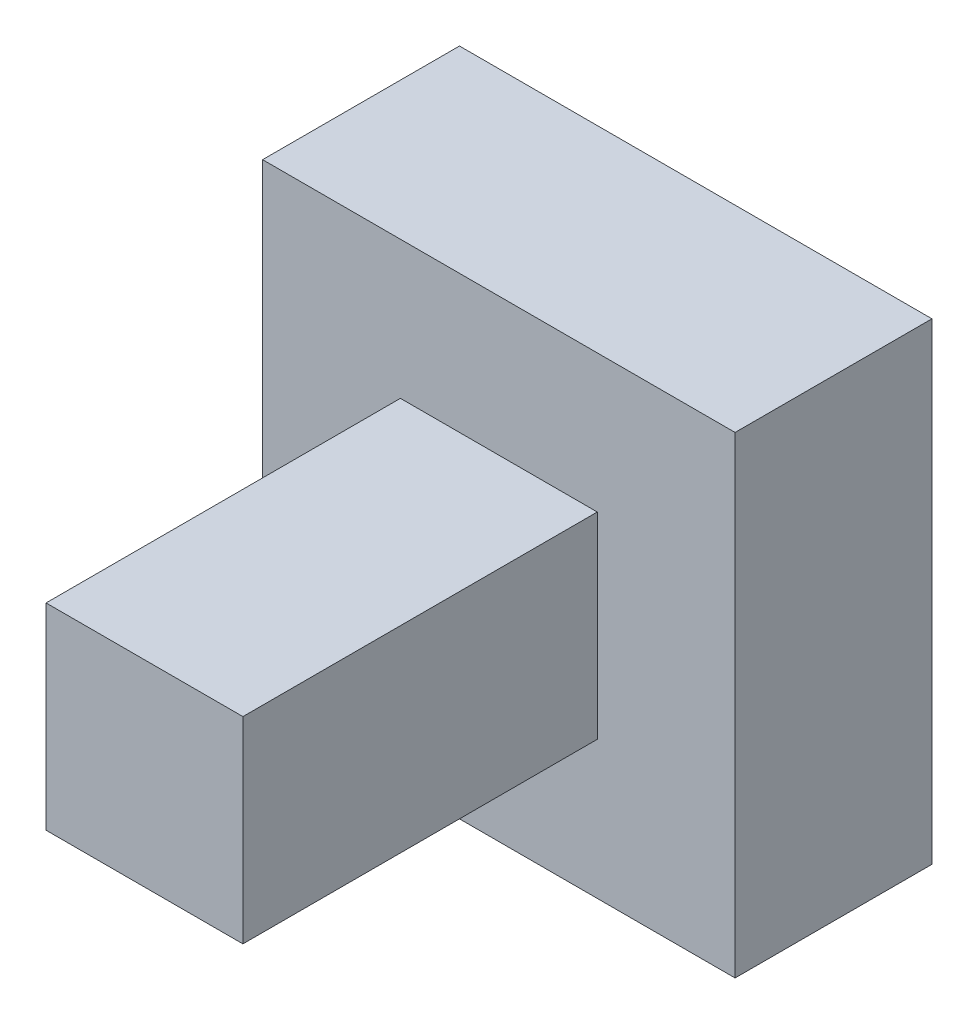
ISO-10303-21;
HEADER;
FILE_DESCRIPTION(('STEP AP214'),'2;1');
FILE_NAME('part.step','',(''),(''),'','','');
FILE_SCHEMA(('AUTOMOTIVE_DESIGN { 1 0 10303 214 1 1 1 1 }'));
ENDSEC;
DATA;
#1=APPLICATION_CONTEXT('core data for automotive mechanical design processes');
#2=APPLICATION_PROTOCOL_DEFINITION('international standard','automotive_design',2000,#1);
#3=PRODUCT_CONTEXT('',#1,'mechanical');
#4=PRODUCT('Part','Part','',(#3));
#5=PRODUCT_RELATED_PRODUCT_CATEGORY('part','',(#4));
#6=PRODUCT_DEFINITION_FORMATION('','',#4);
#7=PRODUCT_DEFINITION_CONTEXT('part definition',#1,'design');
#8=PRODUCT_DEFINITION('design','',#6,#7);
#9=PRODUCT_DEFINITION_SHAPE('','',#8);
#10=(LENGTH_UNIT() NAMED_UNIT(*) SI_UNIT(.MILLI.,.METRE.));
#11=(NAMED_UNIT(*) PLANE_ANGLE_UNIT() SI_UNIT($,.RADIAN.));
#12=(NAMED_UNIT(*) SI_UNIT($,.STERADIAN.) SOLID_ANGLE_UNIT());
#13=UNCERTAINTY_MEASURE_WITH_UNIT(LENGTH_MEASURE(1.E-05),#10,'distance_accuracy_value','');
#14=(GEOMETRIC_REPRESENTATION_CONTEXT(3) GLOBAL_UNCERTAINTY_ASSIGNED_CONTEXT((#13)) GLOBAL_UNIT_ASSIGNED_CONTEXT((#10,
#11,#12)) REPRESENTATION_CONTEXT('',''));
#15=CARTESIAN_POINT('',(0.,0.,0.));
#16=DIRECTION('',(0.,0.,1.));
#17=DIRECTION('',(1.,0.,0.));
#18=AXIS2_PLACEMENT_3D('',#15,#16,#17);
#19=CARTESIAN_POINT('',(0.,0.,2.5));
#20=DIRECTION('',(0.,0.,1.));
#21=DIRECTION('',(1.,0.,0.));
#22=AXIS2_PLACEMENT_3D('',#19,#20,#21);
#23=PLANE('',#22);
#24=DIRECTION('',(0.,1.,0.));
#25=VECTOR('',#24,1.);
#26=CARTESIAN_POINT('',(3.,3.,2.5));
#27=LINE('',#26,#25);
#28=CARTESIAN_POINT('',(3.,-3.,2.5));
#29=VERTEX_POINT('',#28);
#30=CARTESIAN_POINT('',(3.,3.,2.5));
#31=VERTEX_POINT('',#30);
#32=EDGE_CURVE('E140',#29,#31,#27,.T.);
#33=ORIENTED_EDGE('',*,*,#32,.T.);
#34=DIRECTION('',(-1.,0.,0.));
#35=VECTOR('',#34,1.);
#36=CARTESIAN_POINT('',(-3.,3.,2.5));
#37=LINE('',#36,#35);
#38=CARTESIAN_POINT('',(-3.,3.,2.5));
#39=VERTEX_POINT('',#38);
#40=EDGE_CURVE('E85',#31,#39,#37,.T.);
#41=ORIENTED_EDGE('',*,*,#40,.T.);
#42=DIRECTION('',(0.,-1.,0.));
#43=VECTOR('',#42,1.);
#44=CARTESIAN_POINT('',(-3.,3.,2.5));
#45=LINE('',#44,#43);
#46=CARTESIAN_POINT('',(-3.,-3.,2.5));
#47=VERTEX_POINT('',#46);
#48=EDGE_CURVE('E143',#39,#47,#45,.T.);
#49=ORIENTED_EDGE('',*,*,#48,.T.);
#50=DIRECTION('',(1.,0.,0.));
#51=VECTOR('',#50,1.);
#52=CARTESIAN_POINT('',(-3.,-3.,2.5));
#53=LINE('',#52,#51);
#54=EDGE_CURVE('E57',#47,#29,#53,.T.);
#55=ORIENTED_EDGE('',*,*,#54,.T.);
#56=EDGE_LOOP('',(#33,#41,#49,#55));
#57=FACE_BOUND('',#56,.T.);
#58=DIRECTION('',(-1.,0.,0.));
#59=VECTOR('',#58,1.);
#60=CARTESIAN_POINT('',(-1.25,1.25,2.5));
#61=LINE('',#60,#59);
#62=CARTESIAN_POINT('',(1.25,1.25,2.5));
#63=VERTEX_POINT('',#62);
#64=CARTESIAN_POINT('',(-1.25,1.25,2.5));
#65=VERTEX_POINT('',#64);
#66=EDGE_CURVE('E263',#63,#65,#61,.T.);
#67=ORIENTED_EDGE('',*,*,#66,.F.);
#68=DIRECTION('',(0.,1.,0.));
#69=VECTOR('',#68,1.);
#70=CARTESIAN_POINT('',(1.25,1.25,2.5));
#71=LINE('',#70,#69);
#72=CARTESIAN_POINT('',(1.25,-1.25,2.5));
#73=VERTEX_POINT('',#72);
#74=EDGE_CURVE('E130',#73,#63,#71,.T.);
#75=ORIENTED_EDGE('',*,*,#74,.F.);
#76=DIRECTION('',(1.,0.,0.));
#77=VECTOR('',#76,1.);
#78=CARTESIAN_POINT('',(-1.25,-1.25,2.5));
#79=LINE('',#78,#77);
#80=CARTESIAN_POINT('',(-1.25,-1.25,2.5));
#81=VERTEX_POINT('',#80);
#82=EDGE_CURVE('E126',#81,#73,#79,.T.);
#83=ORIENTED_EDGE('',*,*,#82,.F.);
#84=DIRECTION('',(0.,-1.,0.));
#85=VECTOR('',#84,1.);
#86=CARTESIAN_POINT('',(-1.25,1.25,2.5));
#87=LINE('',#86,#85);
#88=EDGE_CURVE('E260',#65,#81,#87,.T.);
#89=ORIENTED_EDGE('',*,*,#88,.F.);
#90=EDGE_LOOP('',(#67,#75,#83,#89));
#91=FACE_BOUND('',#90,.T.);
#92=ADVANCED_FACE('F33',(#57,#91),#23,.T.);
#93=CARTESIAN_POINT('',(3.,3.,2.5));
#94=DIRECTION('',(-1.,0.,0.));
#95=DIRECTION('',(0.,-1.,0.));
#96=AXIS2_PLACEMENT_3D('',#93,#94,#95);
#97=PLANE('',#96);
#98=DIRECTION('',(0.,1.,0.));
#99=VECTOR('',#98,1.);
#100=CARTESIAN_POINT('',(3.,3.,0.));
#101=LINE('',#100,#99);
#102=CARTESIAN_POINT('',(3.,-3.,0.));
#103=VERTEX_POINT('',#102);
#104=CARTESIAN_POINT('',(3.,3.,0.));
#105=VERTEX_POINT('',#104);
#106=EDGE_CURVE('E132',#103,#105,#101,.T.);
#107=ORIENTED_EDGE('',*,*,#106,.T.);
#108=DIRECTION('',(0.,0.,-1.));
#109=VECTOR('',#108,1.);
#110=CARTESIAN_POINT('',(3.,3.,2.5));
#111=LINE('',#110,#109);
#112=EDGE_CURVE('E11',#31,#105,#111,.T.);
#113=ORIENTED_EDGE('',*,*,#112,.F.);
#114=ORIENTED_EDGE('',*,*,#32,.F.);
#115=DIRECTION('',(0.,0.,-1.));
#116=VECTOR('',#115,1.);
#117=CARTESIAN_POINT('',(3.,-3.,2.5));
#118=LINE('',#117,#116);
#119=EDGE_CURVE('E145',#29,#103,#118,.T.);
#120=ORIENTED_EDGE('',*,*,#119,.T.);
#121=EDGE_LOOP('',(#107,#113,#114,#120));
#122=FACE_BOUND('',#121,.T.);
#123=ADVANCED_FACE('F35',(#122),#97,.F.);
#124=CARTESIAN_POINT('',(-3.,3.,2.5));
#125=DIRECTION('',(0.,-1.,0.));
#126=DIRECTION('',(0.,0.,-1.));
#127=AXIS2_PLACEMENT_3D('',#124,#125,#126);
#128=PLANE('',#127);
#129=DIRECTION('',(-1.,0.,0.));
#130=VECTOR('',#129,1.);
#131=CARTESIAN_POINT('',(-3.,3.,0.));
#132=LINE('',#131,#130);
#133=CARTESIAN_POINT('',(-3.,3.,0.));
#134=VERTEX_POINT('',#133);
#135=EDGE_CURVE('E135',#105,#134,#132,.T.);
#136=ORIENTED_EDGE('',*,*,#135,.T.);
#137=DIRECTION('',(0.,0.,-1.));
#138=VECTOR('',#137,1.);
#139=CARTESIAN_POINT('',(-3.,3.,2.5));
#140=LINE('',#139,#138);
#141=EDGE_CURVE('E41',#39,#134,#140,.T.);
#142=ORIENTED_EDGE('',*,*,#141,.F.);
#143=ORIENTED_EDGE('',*,*,#40,.F.);
#144=ORIENTED_EDGE('',*,*,#112,.T.);
#145=EDGE_LOOP('',(#136,#142,#143,#144));
#146=FACE_BOUND('',#145,.T.);
#147=ADVANCED_FACE('F173',(#146),#128,.F.);
#148=CARTESIAN_POINT('',(-3.,3.,2.5));
#149=DIRECTION('',(1.,0.,0.));
#150=DIRECTION('',(0.,1.,0.));
#151=AXIS2_PLACEMENT_3D('',#148,#149,#150);
#152=PLANE('',#151);
#153=DIRECTION('',(0.,-1.,0.));
#154=VECTOR('',#153,1.);
#155=CARTESIAN_POINT('',(-3.,3.,0.));
#156=LINE('',#155,#154);
#157=CARTESIAN_POINT('',(-3.,-3.,0.));
#158=VERTEX_POINT('',#157);
#159=EDGE_CURVE('E148',#134,#158,#156,.T.);
#160=ORIENTED_EDGE('',*,*,#159,.T.);
#161=DIRECTION('',(0.,0.,-1.));
#162=VECTOR('',#161,1.);
#163=CARTESIAN_POINT('',(-3.,-3.,2.5));
#164=LINE('',#163,#162);
#165=EDGE_CURVE('E152',#47,#158,#164,.T.);
#166=ORIENTED_EDGE('',*,*,#165,.F.);
#167=ORIENTED_EDGE('',*,*,#48,.F.);
#168=ORIENTED_EDGE('',*,*,#141,.T.);
#169=EDGE_LOOP('',(#160,#166,#167,#168));
#170=FACE_BOUND('',#169,.T.);
#171=ADVANCED_FACE('F157',(#170),#152,.F.);
#172=CARTESIAN_POINT('',(-3.,-3.,2.5));
#173=DIRECTION('',(0.,1.,0.));
#174=DIRECTION('',(0.,0.,1.));
#175=AXIS2_PLACEMENT_3D('',#172,#173,#174);
#176=PLANE('',#175);
#177=DIRECTION('',(1.,0.,0.));
#178=VECTOR('',#177,1.);
#179=CARTESIAN_POINT('',(-3.,-3.,0.));
#180=LINE('',#179,#178);
#181=EDGE_CURVE('E78',#158,#103,#180,.T.);
#182=ORIENTED_EDGE('',*,*,#181,.T.);
#183=ORIENTED_EDGE('',*,*,#119,.F.);
#184=ORIENTED_EDGE('',*,*,#54,.F.);
#185=ORIENTED_EDGE('',*,*,#165,.T.);
#186=EDGE_LOOP('',(#182,#183,#184,#185));
#187=FACE_BOUND('',#186,.T.);
#188=ADVANCED_FACE('F165',(#187),#176,.F.);
#189=CARTESIAN_POINT('',(0.,0.,0.));
#190=DIRECTION('',(0.,0.,1.));
#191=DIRECTION('',(1.,0.,0.));
#192=AXIS2_PLACEMENT_3D('',#189,#190,#191);
#193=PLANE('',#192);
#194=ORIENTED_EDGE('',*,*,#106,.F.);
#195=ORIENTED_EDGE('',*,*,#181,.F.);
#196=ORIENTED_EDGE('',*,*,#159,.F.);
#197=ORIENTED_EDGE('',*,*,#135,.F.);
#198=EDGE_LOOP('',(#194,#195,#196,#197));
#199=FACE_BOUND('',#198,.T.);
#200=ADVANCED_FACE('F161',(#199),#193,.F.);
#201=CARTESIAN_POINT('',(1.25,1.25,7.));
#202=DIRECTION('',(-1.,0.,0.));
#203=DIRECTION('',(0.,-1.,0.));
#204=AXIS2_PLACEMENT_3D('',#201,#202,#203);
#205=PLANE('',#204);
#206=ORIENTED_EDGE('',*,*,#74,.T.);
#207=DIRECTION('',(0.,0.,-1.));
#208=VECTOR('',#207,1.);
#209=CARTESIAN_POINT('',(1.25,1.25,7.));
#210=LINE('',#209,#208);
#211=CARTESIAN_POINT('',(1.25,1.25,7.));
#212=VERTEX_POINT('',#211);
#213=EDGE_CURVE('E111',#212,#63,#210,.T.);
#214=ORIENTED_EDGE('',*,*,#213,.F.);
#215=DIRECTION('',(0.,1.,0.));
#216=VECTOR('',#215,1.);
#217=CARTESIAN_POINT('',(1.25,1.25,7.));
#218=LINE('',#217,#216);
#219=CARTESIAN_POINT('',(1.25,-1.25,7.));
#220=VERTEX_POINT('',#219);
#221=EDGE_CURVE('E118',#220,#212,#218,.T.);
#222=ORIENTED_EDGE('',*,*,#221,.F.);
#223=DIRECTION('',(0.,0.,-1.));
#224=VECTOR('',#223,1.);
#225=CARTESIAN_POINT('',(1.25,-1.25,7.));
#226=LINE('',#225,#224);
#227=EDGE_CURVE('E258',#220,#73,#226,.T.);
#228=ORIENTED_EDGE('',*,*,#227,.T.);
#229=EDGE_LOOP('',(#206,#214,#222,#228));
#230=FACE_BOUND('',#229,.T.);
#231=ADVANCED_FACE('F128',(#230),#205,.F.);
#232=CARTESIAN_POINT('',(-1.25,1.25,7.));
#233=DIRECTION('',(0.,-1.,0.));
#234=DIRECTION('',(0.,0.,-1.));
#235=AXIS2_PLACEMENT_3D('',#232,#233,#234);
#236=PLANE('',#235);
#237=ORIENTED_EDGE('',*,*,#66,.T.);
#238=DIRECTION('',(0.,0.,-1.));
#239=VECTOR('',#238,1.);
#240=CARTESIAN_POINT('',(-1.25,1.25,7.));
#241=LINE('',#240,#239);
#242=CARTESIAN_POINT('',(-1.25,1.25,7.));
#243=VERTEX_POINT('',#242);
#244=EDGE_CURVE('E114',#243,#65,#241,.T.);
#245=ORIENTED_EDGE('',*,*,#244,.F.);
#246=DIRECTION('',(-1.,0.,0.));
#247=VECTOR('',#246,1.);
#248=CARTESIAN_POINT('',(-1.25,1.25,7.));
#249=LINE('',#248,#247);
#250=EDGE_CURVE('E107',#212,#243,#249,.T.);
#251=ORIENTED_EDGE('',*,*,#250,.F.);
#252=ORIENTED_EDGE('',*,*,#213,.T.);
#253=EDGE_LOOP('',(#237,#245,#251,#252));
#254=FACE_BOUND('',#253,.T.);
#255=ADVANCED_FACE('F109',(#254),#236,.F.);
#256=CARTESIAN_POINT('',(-1.25,1.25,7.));
#257=DIRECTION('',(1.,0.,0.));
#258=DIRECTION('',(0.,1.,0.));
#259=AXIS2_PLACEMENT_3D('',#256,#257,#258);
#260=PLANE('',#259);
#261=ORIENTED_EDGE('',*,*,#88,.T.);
#262=DIRECTION('',(0.,0.,-1.));
#263=VECTOR('',#262,1.);
#264=CARTESIAN_POINT('',(-1.25,-1.25,7.));
#265=LINE('',#264,#263);
#266=CARTESIAN_POINT('',(-1.25,-1.25,7.));
#267=VERTEX_POINT('',#266);
#268=EDGE_CURVE('E48',#267,#81,#265,.T.);
#269=ORIENTED_EDGE('',*,*,#268,.F.);
#270=DIRECTION('',(0.,-1.,0.));
#271=VECTOR('',#270,1.);
#272=CARTESIAN_POINT('',(-1.25,1.25,7.));
#273=LINE('',#272,#271);
#274=EDGE_CURVE('E117',#243,#267,#273,.T.);
#275=ORIENTED_EDGE('',*,*,#274,.F.);
#276=ORIENTED_EDGE('',*,*,#244,.T.);
#277=EDGE_LOOP('',(#261,#269,#275,#276));
#278=FACE_BOUND('',#277,.T.);
#279=ADVANCED_FACE('F186',(#278),#260,.F.);
#280=CARTESIAN_POINT('',(-1.25,-1.25,7.));
#281=DIRECTION('',(0.,1.,0.));
#282=DIRECTION('',(0.,0.,1.));
#283=AXIS2_PLACEMENT_3D('',#280,#281,#282);
#284=PLANE('',#283);
#285=ORIENTED_EDGE('',*,*,#82,.T.);
#286=ORIENTED_EDGE('',*,*,#227,.F.);
#287=DIRECTION('',(1.,0.,0.));
#288=VECTOR('',#287,1.);
#289=CARTESIAN_POINT('',(-1.25,-1.25,7.));
#290=LINE('',#289,#288);
#291=EDGE_CURVE('E122',#267,#220,#290,.T.);
#292=ORIENTED_EDGE('',*,*,#291,.F.);
#293=ORIENTED_EDGE('',*,*,#268,.T.);
#294=EDGE_LOOP('',(#285,#286,#292,#293));
#295=FACE_BOUND('',#294,.T.);
#296=ADVANCED_FACE('F189',(#295),#284,.F.);
#297=CARTESIAN_POINT('',(0.,0.,7.));
#298=DIRECTION('',(0.,0.,1.));
#299=DIRECTION('',(1.,0.,0.));
#300=AXIS2_PLACEMENT_3D('',#297,#298,#299);
#301=PLANE('',#300);
#302=ORIENTED_EDGE('',*,*,#221,.T.);
#303=ORIENTED_EDGE('',*,*,#250,.T.);
#304=ORIENTED_EDGE('',*,*,#274,.T.);
#305=ORIENTED_EDGE('',*,*,#291,.T.);
#306=EDGE_LOOP('',(#302,#303,#304,#305));
#307=FACE_BOUND('',#306,.T.);
#308=ADVANCED_FACE('F121',(#307),#301,.T.);
#309=CLOSED_SHELL('',(#92,#123,#147,#171,#188,#200,#231,#255,#279,#296,#308));
#310=MANIFOLD_SOLID_BREP('B2',#309);
#311=ADVANCED_BREP_SHAPE_REPRESENTATION('',(#18,#310),#14);
#312=SHAPE_DEFINITION_REPRESENTATION(#9,#311);
ENDSEC;
END-ISO-10303-21;
